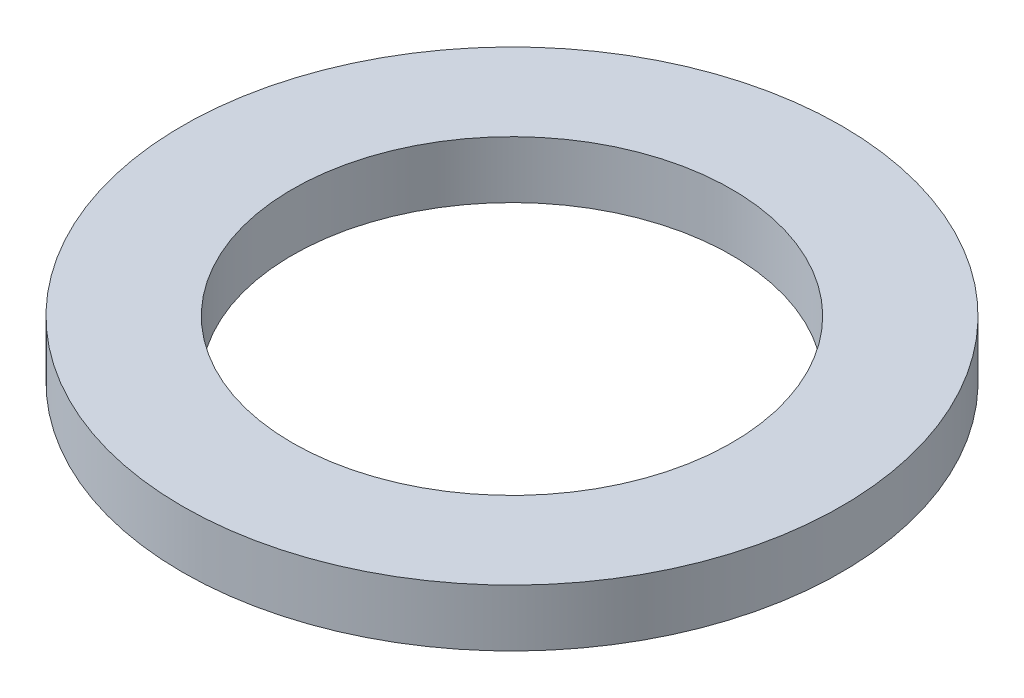
ISO-10303-21;
HEADER;
FILE_DESCRIPTION(('STEP AP214'),'2;1');
FILE_NAME('part.step','',(''),(''),'','','');
FILE_SCHEMA(('AUTOMOTIVE_DESIGN { 1 0 10303 214 1 1 1 1 }'));
ENDSEC;
DATA;
#1=APPLICATION_CONTEXT('core data for automotive mechanical design processes');
#2=APPLICATION_PROTOCOL_DEFINITION('international standard','automotive_design',2000,#1);
#3=PRODUCT_CONTEXT('',#1,'mechanical');
#4=PRODUCT('Part','Part','',(#3));
#5=PRODUCT_RELATED_PRODUCT_CATEGORY('part','',(#4));
#6=PRODUCT_DEFINITION_FORMATION('','',#4);
#7=PRODUCT_DEFINITION_CONTEXT('part definition',#1,'design');
#8=PRODUCT_DEFINITION('design','',#6,#7);
#9=PRODUCT_DEFINITION_SHAPE('','',#8);
#10=(LENGTH_UNIT() NAMED_UNIT(*) SI_UNIT(.MILLI.,.METRE.));
#11=(NAMED_UNIT(*) PLANE_ANGLE_UNIT() SI_UNIT($,.RADIAN.));
#12=(NAMED_UNIT(*) SI_UNIT($,.STERADIAN.) SOLID_ANGLE_UNIT());
#13=UNCERTAINTY_MEASURE_WITH_UNIT(LENGTH_MEASURE(1.E-05),#10,'distance_accuracy_value','');
#14=(GEOMETRIC_REPRESENTATION_CONTEXT(3) GLOBAL_UNCERTAINTY_ASSIGNED_CONTEXT((#13)) GLOBAL_UNIT_ASSIGNED_CONTEXT((#10,
#11,#12)) REPRESENTATION_CONTEXT('',''));
#15=CARTESIAN_POINT('',(0.,0.,0.));
#16=DIRECTION('',(0.,0.,1.));
#17=DIRECTION('',(1.,0.,0.));
#18=AXIS2_PLACEMENT_3D('',#15,#16,#17);
#19=CARTESIAN_POINT('',(0.,1.65,0.));
#20=DIRECTION('',(0.,1.,0.));
#21=DIRECTION('',(0.,0.,1.));
#22=AXIS2_PLACEMENT_3D('',#19,#20,#21);
#23=PLANE('',#22);
#24=CARTESIAN_POINT('',(0.,1.65,0.));
#25=DIRECTION('',(0.,1.,0.));
#26=DIRECTION('',(0.,0.,1.));
#27=AXIS2_PLACEMENT_3D('',#24,#25,#26);
#28=CIRCLE('',#27,9.525);
#29=CARTESIAN_POINT('',(0.,1.65,9.525));
#30=VERTEX_POINT('',#29);
#31=EDGE_CURVE('E10',#30,#30,#28,.T.);
#32=ORIENTED_EDGE('',*,*,#31,.T.);
#33=EDGE_LOOP('',(#32));
#34=FACE_BOUND('',#33,.T.);
#35=CARTESIAN_POINT('',(0.,1.65,0.));
#36=DIRECTION('',(0.,1.,0.));
#37=DIRECTION('',(0.,0.,1.));
#38=AXIS2_PLACEMENT_3D('',#35,#36,#37);
#39=CIRCLE('',#38,6.35);
#40=CARTESIAN_POINT('',(0.,1.65,6.35));
#41=VERTEX_POINT('',#40);
#42=EDGE_CURVE('E41',#41,#41,#39,.T.);
#43=ORIENTED_EDGE('',*,*,#42,.F.);
#44=EDGE_LOOP('',(#43));
#45=FACE_BOUND('',#44,.T.);
#46=ADVANCED_FACE('F30',(#34,#45),#23,.T.);
#47=CARTESIAN_POINT('',(0.,0.,0.));
#48=DIRECTION('',(0.,1.,0.));
#49=DIRECTION('',(0.,0.,1.));
#50=AXIS2_PLACEMENT_3D('',#47,#48,#49);
#51=PLANE('',#50);
#52=CARTESIAN_POINT('',(0.,0.,0.));
#53=DIRECTION('',(0.,1.,0.));
#54=DIRECTION('',(0.,0.,1.));
#55=AXIS2_PLACEMENT_3D('',#52,#53,#54);
#56=CIRCLE('',#55,9.525);
#57=CARTESIAN_POINT('',(0.,0.,9.525));
#58=VERTEX_POINT('',#57);
#59=EDGE_CURVE('E34',#58,#58,#56,.T.);
#60=ORIENTED_EDGE('',*,*,#59,.F.);
#61=EDGE_LOOP('',(#60));
#62=FACE_BOUND('',#61,.T.);
#63=CARTESIAN_POINT('',(0.,0.,0.));
#64=DIRECTION('',(0.,1.,0.));
#65=DIRECTION('',(0.,0.,1.));
#66=AXIS2_PLACEMENT_3D('',#63,#64,#65);
#67=CIRCLE('',#66,6.35);
#68=CARTESIAN_POINT('',(0.,0.,6.35));
#69=VERTEX_POINT('',#68);
#70=EDGE_CURVE('E43',#69,#69,#67,.T.);
#71=ORIENTED_EDGE('',*,*,#70,.T.);
#72=EDGE_LOOP('',(#71));
#73=FACE_BOUND('',#72,.T.);
#74=ADVANCED_FACE('F53',(#62,#73),#51,.F.);
#75=CARTESIAN_POINT('',(0.,1.65,0.));
#76=DIRECTION('',(0.,-1.,0.));
#77=DIRECTION('',(0.,0.,-1.));
#78=AXIS2_PLACEMENT_3D('',#75,#76,#77);
#79=CYLINDRICAL_SURFACE('',#78,9.525);
#80=ORIENTED_EDGE('',*,*,#31,.F.);
#81=EDGE_LOOP('',(#80));
#82=FACE_BOUND('',#81,.T.);
#83=ORIENTED_EDGE('',*,*,#59,.T.);
#84=EDGE_LOOP('',(#83));
#85=FACE_BOUND('',#84,.T.);
#86=ADVANCED_FACE('F32',(#82,#85),#79,.T.);
#87=CARTESIAN_POINT('',(0.,1.65,0.));
#88=DIRECTION('',(0.,-1.,0.));
#89=DIRECTION('',(0.,0.,-1.));
#90=AXIS2_PLACEMENT_3D('',#87,#88,#89);
#91=CYLINDRICAL_SURFACE('',#90,6.35);
#92=ORIENTED_EDGE('',*,*,#42,.T.);
#93=EDGE_LOOP('',(#92));
#94=FACE_BOUND('',#93,.T.);
#95=ORIENTED_EDGE('',*,*,#70,.F.);
#96=EDGE_LOOP('',(#95));
#97=FACE_BOUND('',#96,.T.);
#98=ADVANCED_FACE('F49',(#94,#97),#91,.F.);
#99=CLOSED_SHELL('',(#46,#74,#86,#98));
#100=MANIFOLD_SOLID_BREP('B2',#99);
#101=ADVANCED_BREP_SHAPE_REPRESENTATION('',(#18,#100),#14);
#102=SHAPE_DEFINITION_REPRESENTATION(#9,#101);
ENDSEC;
END-ISO-10303-21;
